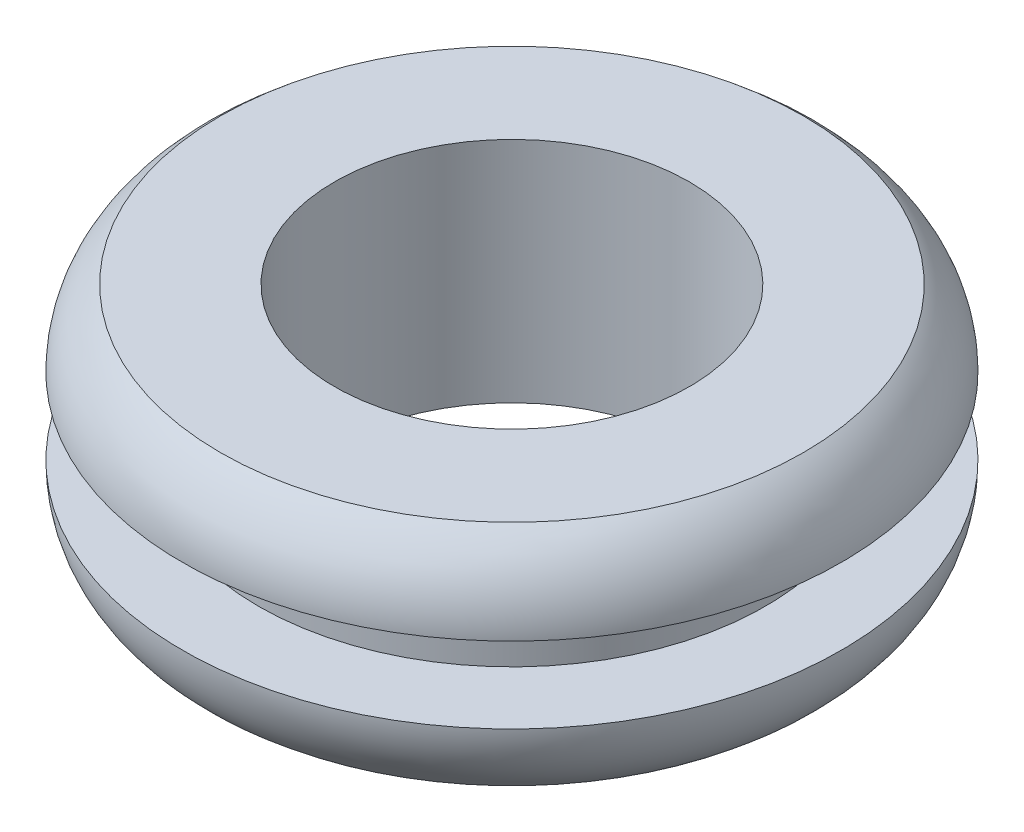
ISO-10303-21;
HEADER;
FILE_DESCRIPTION(('STEP AP214'),'2;1');
FILE_NAME('part.step','',(''),(''),'','','');
FILE_SCHEMA(('AUTOMOTIVE_DESIGN { 1 0 10303 214 1 1 1 1 }'));
ENDSEC;
DATA;
#1=APPLICATION_CONTEXT('core data for automotive mechanical design processes');
#2=APPLICATION_PROTOCOL_DEFINITION('international standard','automotive_design',2000,#1);
#3=PRODUCT_CONTEXT('',#1,'mechanical');
#4=PRODUCT('Part','Part','',(#3));
#5=PRODUCT_RELATED_PRODUCT_CATEGORY('part','',(#4));
#6=PRODUCT_DEFINITION_FORMATION('','',#4);
#7=PRODUCT_DEFINITION_CONTEXT('part definition',#1,'design');
#8=PRODUCT_DEFINITION('design','',#6,#7);
#9=PRODUCT_DEFINITION_SHAPE('','',#8);
#10=(LENGTH_UNIT() NAMED_UNIT(*) SI_UNIT(.MILLI.,.METRE.));
#11=(NAMED_UNIT(*) PLANE_ANGLE_UNIT() SI_UNIT($,.RADIAN.));
#12=(NAMED_UNIT(*) SI_UNIT($,.STERADIAN.) SOLID_ANGLE_UNIT());
#13=UNCERTAINTY_MEASURE_WITH_UNIT(LENGTH_MEASURE(1.E-05),#10,'distance_accuracy_value','');
#14=(GEOMETRIC_REPRESENTATION_CONTEXT(3) GLOBAL_UNCERTAINTY_ASSIGNED_CONTEXT((#13)) GLOBAL_UNIT_ASSIGNED_CONTEXT((#10,
#11,#12)) REPRESENTATION_CONTEXT('',''));
#15=CARTESIAN_POINT('',(0.,0.,0.));
#16=DIRECTION('',(0.,0.,1.));
#17=DIRECTION('',(1.,0.,0.));
#18=AXIS2_PLACEMENT_3D('',#15,#16,#17);
#19=CARTESIAN_POINT('',(0.,2.38125000000001,0.));
#20=DIRECTION('',(0.,-1.,0.));
#21=DIRECTION('',(0.,0.,-1.));
#22=AXIS2_PLACEMENT_3D('',#19,#20,#21);
#23=TOROIDAL_SURFACE('',#22,14.6843750000001,5.95312499999995);
#24=CARTESIAN_POINT('',(0.,7.14375000000001,0.));
#25=DIRECTION('',(0.,-1.,0.));
#26=DIRECTION('',(0.,0.,-1.));
#27=AXIS2_PLACEMENT_3D('',#24,#25,#26);
#28=CIRCLE('',#27,18.25625);
#29=CARTESIAN_POINT('',(0.,7.14375000000001,-18.25625));
#30=VERTEX_POINT('',#29);
#31=EDGE_CURVE('E10',#30,#30,#28,.T.);
#32=ORIENTED_EDGE('',*,*,#31,.T.);
#33=EDGE_LOOP('',(#32));
#34=FACE_BOUND('',#33,.T.);
#35=CARTESIAN_POINT('',(0.,2.38125,0.));
#36=DIRECTION('',(0.,-1.,0.));
#37=DIRECTION('',(0.,0.,-1.));
#38=AXIS2_PLACEMENT_3D('',#35,#36,#37);
#39=CIRCLE('',#38,20.6375);
#40=CARTESIAN_POINT('',(0.,2.38125000000001,-20.6375));
#41=VERTEX_POINT('',#40);
#42=EDGE_CURVE('E58',#41,#41,#39,.T.);
#43=ORIENTED_EDGE('',*,*,#42,.F.);
#44=EDGE_LOOP('',(#43));
#45=FACE_BOUND('',#44,.T.);
#46=ADVANCED_FACE('F30',(#34,#45),#23,.T.);
#47=CARTESIAN_POINT('',(0.,7.14375,11.1125));
#48=DIRECTION('',(0.,-1.,0.));
#49=DIRECTION('',(0.,0.,-1.));
#50=AXIS2_PLACEMENT_3D('',#47,#48,#49);
#51=PLANE('',#50);
#52=ORIENTED_EDGE('',*,*,#31,.F.);
#53=EDGE_LOOP('',(#52));
#54=FACE_BOUND('',#53,.T.);
#55=CARTESIAN_POINT('',(0.,7.14375,0.));
#56=DIRECTION('',(0.,-1.,0.));
#57=DIRECTION('',(0.,0.,-1.));
#58=AXIS2_PLACEMENT_3D('',#55,#56,#57);
#59=CIRCLE('',#58,11.1125);
#60=CARTESIAN_POINT('',(0.,7.14375,-11.1125));
#61=VERTEX_POINT('',#60);
#62=EDGE_CURVE('E36',#61,#61,#59,.T.);
#63=ORIENTED_EDGE('',*,*,#62,.T.);
#64=EDGE_LOOP('',(#63));
#65=FACE_BOUND('',#64,.T.);
#66=ADVANCED_FACE('F65',(#54,#65),#51,.F.);
#67=CARTESIAN_POINT('',(0.,-7.14375,0.));
#68=DIRECTION('',(0.,-1.,0.));
#69=DIRECTION('',(0.,0.,-1.));
#70=AXIS2_PLACEMENT_3D('',#67,#68,#69);
#71=CYLINDRICAL_SURFACE('',#70,11.1125);
#72=ORIENTED_EDGE('',*,*,#62,.F.);
#73=EDGE_LOOP('',(#72));
#74=FACE_BOUND('',#73,.T.);
#75=CARTESIAN_POINT('',(0.,-7.14375,0.));
#76=DIRECTION('',(0.,-1.,0.));
#77=DIRECTION('',(0.,0.,-1.));
#78=AXIS2_PLACEMENT_3D('',#75,#76,#77);
#79=CIRCLE('',#78,11.1125);
#80=CARTESIAN_POINT('',(0.,-7.14375,-11.1125));
#81=VERTEX_POINT('',#80);
#82=EDGE_CURVE('E40',#81,#81,#79,.T.);
#83=ORIENTED_EDGE('',*,*,#82,.T.);
#84=EDGE_LOOP('',(#83));
#85=FACE_BOUND('',#84,.T.);
#86=ADVANCED_FACE('F69',(#74,#85),#71,.F.);
#87=CARTESIAN_POINT('',(0.,-7.14374999999999,11.1125));
#88=DIRECTION('',(0.,-1.,0.));
#89=DIRECTION('',(0.,0.,-1.));
#90=AXIS2_PLACEMENT_3D('',#87,#88,#89);
#91=PLANE('',#90);
#92=CARTESIAN_POINT('',(0.,-7.14374999999998,0.));
#93=DIRECTION('',(0.,-1.,0.));
#94=DIRECTION('',(0.,0.,-1.));
#95=AXIS2_PLACEMENT_3D('',#92,#93,#94);
#96=CIRCLE('',#95,18.25625);
#97=CARTESIAN_POINT('',(0.,-7.14374999999997,-18.25625));
#98=VERTEX_POINT('',#97);
#99=EDGE_CURVE('E44',#98,#98,#96,.T.);
#100=ORIENTED_EDGE('',*,*,#99,.T.);
#101=EDGE_LOOP('',(#100));
#102=FACE_BOUND('',#101,.T.);
#103=ORIENTED_EDGE('',*,*,#82,.F.);
#104=EDGE_LOOP('',(#103));
#105=FACE_BOUND('',#104,.T.);
#106=ADVANCED_FACE('F74',(#102,#105),#91,.T.);
#107=CARTESIAN_POINT('',(0.,-2.38125,0.));
#108=DIRECTION('',(0.,-1.,0.));
#109=DIRECTION('',(0.,0.,-1.));
#110=AXIS2_PLACEMENT_3D('',#107,#108,#109);
#111=TOROIDAL_SURFACE('',#110,14.6843750000001,5.95312499999995);
#112=ORIENTED_EDGE('',*,*,#99,.F.);
#113=EDGE_LOOP('',(#112));
#114=FACE_BOUND('',#113,.T.);
#115=CARTESIAN_POINT('',(0.,-2.38125,0.));
#116=DIRECTION('',(0.,-1.,0.));
#117=DIRECTION('',(0.,0.,-1.));
#118=AXIS2_PLACEMENT_3D('',#115,#116,#117);
#119=CIRCLE('',#118,20.6375);
#120=CARTESIAN_POINT('',(0.,-2.38124999999999,-20.6375));
#121=VERTEX_POINT('',#120);
#122=EDGE_CURVE('E49',#121,#121,#119,.T.);
#123=ORIENTED_EDGE('',*,*,#122,.T.);
#124=EDGE_LOOP('',(#123));
#125=FACE_BOUND('',#124,.T.);
#126=ADVANCED_FACE('F80',(#114,#125),#111,.T.);
#127=CARTESIAN_POINT('',(0.,-2.38125,15.8750000000001));
#128=DIRECTION('',(0.,-1.,0.));
#129=DIRECTION('',(0.,0.,-1.));
#130=AXIS2_PLACEMENT_3D('',#127,#128,#129);
#131=PLANE('',#130);
#132=ORIENTED_EDGE('',*,*,#122,.F.);
#133=EDGE_LOOP('',(#132));
#134=FACE_BOUND('',#133,.T.);
#135=CARTESIAN_POINT('',(0.,-2.38125,0.));
#136=DIRECTION('',(0.,-1.,0.));
#137=DIRECTION('',(0.,0.,-1.));
#138=AXIS2_PLACEMENT_3D('',#135,#136,#137);
#139=CIRCLE('',#138,15.8750000000001);
#140=CARTESIAN_POINT('',(0.,-2.38125,-15.8750000000001));
#141=VERTEX_POINT('',#140);
#142=EDGE_CURVE('E52',#141,#141,#139,.T.);
#143=ORIENTED_EDGE('',*,*,#142,.T.);
#144=EDGE_LOOP('',(#143));
#145=FACE_BOUND('',#144,.T.);
#146=ADVANCED_FACE('F84',(#134,#145),#131,.F.);
#147=CARTESIAN_POINT('',(0.,-7.14375,0.));
#148=DIRECTION('',(0.,-1.,0.));
#149=DIRECTION('',(0.,0.,-1.));
#150=AXIS2_PLACEMENT_3D('',#147,#148,#149);
#151=CYLINDRICAL_SURFACE('',#150,15.8750000000001);
#152=ORIENTED_EDGE('',*,*,#142,.F.);
#153=EDGE_LOOP('',(#152));
#154=FACE_BOUND('',#153,.T.);
#155=CARTESIAN_POINT('',(0.,2.38125,0.));
#156=DIRECTION('',(0.,-1.,0.));
#157=DIRECTION('',(0.,0.,-1.));
#158=AXIS2_PLACEMENT_3D('',#155,#156,#157);
#159=CIRCLE('',#158,15.8750000000001);
#160=CARTESIAN_POINT('',(0.,2.38125000000001,-15.8750000000001));
#161=VERTEX_POINT('',#160);
#162=EDGE_CURVE('E55',#161,#161,#159,.T.);
#163=ORIENTED_EDGE('',*,*,#162,.T.);
#164=EDGE_LOOP('',(#163));
#165=FACE_BOUND('',#164,.T.);
#166=ADVANCED_FACE('F88',(#154,#165),#151,.T.);
#167=CARTESIAN_POINT('',(0.,2.38125,20.6375));
#168=DIRECTION('',(0.,1.,0.));
#169=DIRECTION('',(0.,0.,1.));
#170=AXIS2_PLACEMENT_3D('',#167,#168,#169);
#171=PLANE('',#170);
#172=ORIENTED_EDGE('',*,*,#162,.F.);
#173=EDGE_LOOP('',(#172));
#174=FACE_BOUND('',#173,.T.);
#175=ORIENTED_EDGE('',*,*,#42,.T.);
#176=EDGE_LOOP('',(#175));
#177=FACE_BOUND('',#176,.T.);
#178=ADVANCED_FACE('F62',(#174,#177),#171,.F.);
#179=CLOSED_SHELL('',(#46,#66,#86,#106,#126,#146,#166,#178));
#180=MANIFOLD_SOLID_BREP('B2',#179);
#181=ADVANCED_BREP_SHAPE_REPRESENTATION('',(#18,#180),#14);
#182=SHAPE_DEFINITION_REPRESENTATION(#9,#181);
ENDSEC;
END-ISO-10303-21;
